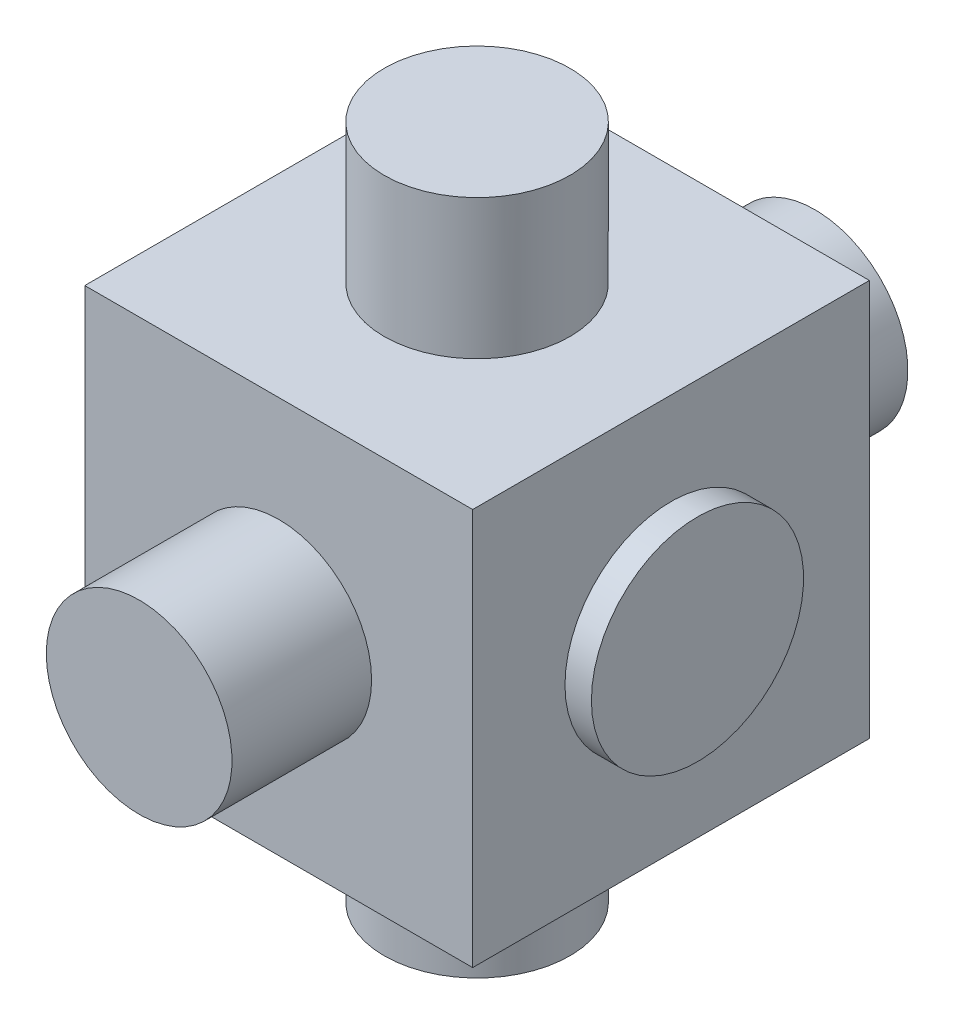
ISO-10303-21;
HEADER;
FILE_DESCRIPTION(('STEP AP214'),'2;1');
FILE_NAME('part.step','',(''),(''),'','','');
FILE_SCHEMA(('AUTOMOTIVE_DESIGN { 1 0 10303 214 1 1 1 1 }'));
ENDSEC;
DATA;
#1=APPLICATION_CONTEXT('core data for automotive mechanical design processes');
#2=APPLICATION_PROTOCOL_DEFINITION('international standard','automotive_design',2000,#1);
#3=PRODUCT_CONTEXT('',#1,'mechanical');
#4=PRODUCT('Part','Part','',(#3));
#5=PRODUCT_RELATED_PRODUCT_CATEGORY('part','',(#4));
#6=PRODUCT_DEFINITION_FORMATION('','',#4);
#7=PRODUCT_DEFINITION_CONTEXT('part definition',#1,'design');
#8=PRODUCT_DEFINITION('design','',#6,#7);
#9=PRODUCT_DEFINITION_SHAPE('','',#8);
#10=(LENGTH_UNIT() NAMED_UNIT(*) SI_UNIT(.MILLI.,.METRE.));
#11=(NAMED_UNIT(*) PLANE_ANGLE_UNIT() SI_UNIT($,.RADIAN.));
#12=(NAMED_UNIT(*) SI_UNIT($,.STERADIAN.) SOLID_ANGLE_UNIT());
#13=UNCERTAINTY_MEASURE_WITH_UNIT(LENGTH_MEASURE(1.E-05),#10,'distance_accuracy_value','');
#14=(GEOMETRIC_REPRESENTATION_CONTEXT(3) GLOBAL_UNCERTAINTY_ASSIGNED_CONTEXT((#13)) GLOBAL_UNIT_ASSIGNED_CONTEXT((#10,
#11,#12)) REPRESENTATION_CONTEXT('',''));
#15=CARTESIAN_POINT('',(0.,0.,0.));
#16=DIRECTION('',(0.,0.,1.));
#17=DIRECTION('',(1.,0.,0.));
#18=AXIS2_PLACEMENT_3D('',#15,#16,#17);
#19=CARTESIAN_POINT('',(19.4,6.75,6.75));
#20=DIRECTION('',(1.,0.,0.));
#21=DIRECTION('',(0.,0.,-1.));
#22=AXIS2_PLACEMENT_3D('',#19,#20,#21);
#23=PLANE('',#22);
#24=DIRECTION('',(0.,0.,-1.));
#25=VECTOR('',#24,1.);
#26=CARTESIAN_POINT('',(19.4,6.75,6.75));
#27=LINE('',#26,#25);
#28=CARTESIAN_POINT('',(19.4,6.75,6.75));
#29=VERTEX_POINT('',#28);
#30=CARTESIAN_POINT('',(19.4,6.75,-6.75));
#31=VERTEX_POINT('',#30);
#32=EDGE_CURVE('E75',#29,#31,#27,.T.);
#33=ORIENTED_EDGE('',*,*,#32,.T.);
#34=DIRECTION('',(0.,-1.,0.));
#35=VECTOR('',#34,1.);
#36=CARTESIAN_POINT('',(19.4,6.75,-6.75));
#37=LINE('',#36,#35);
#38=CARTESIAN_POINT('',(19.4,-6.75,-6.75));
#39=VERTEX_POINT('',#38);
#40=EDGE_CURVE('E79',#31,#39,#37,.T.);
#41=ORIENTED_EDGE('',*,*,#40,.T.);
#42=DIRECTION('',(0.,0.,-1.));
#43=VECTOR('',#42,1.);
#44=CARTESIAN_POINT('',(19.4,-6.75,6.75));
#45=LINE('',#44,#43);
#46=CARTESIAN_POINT('',(19.4,-6.75,6.75));
#47=VERTEX_POINT('',#46);
#48=EDGE_CURVE('E85',#47,#39,#45,.T.);
#49=ORIENTED_EDGE('',*,*,#48,.F.);
#50=DIRECTION('',(0.,-1.,0.));
#51=VECTOR('',#50,1.);
#52=CARTESIAN_POINT('',(19.4,6.75,6.75));
#53=LINE('',#52,#51);
#54=EDGE_CURVE('E80',#29,#47,#53,.T.);
#55=ORIENTED_EDGE('',*,*,#54,.F.);
#56=EDGE_LOOP('',(#33,#41,#49,#55));
#57=FACE_BOUND('',#56,.T.);
#58=CARTESIAN_POINT('',(19.4,0.,0.));
#59=DIRECTION('',(1.,0.,0.));
#60=DIRECTION('',(0.,0.,-1.));
#61=AXIS2_PLACEMENT_3D('',#58,#59,#60);
#62=CIRCLE('',#61,3.61);
#63=CARTESIAN_POINT('',(19.4,0.,-3.61));
#64=VERTEX_POINT('',#63);
#65=EDGE_CURVE('E11',#64,#64,#62,.F.);
#66=ORIENTED_EDGE('',*,*,#65,.F.);
#67=EDGE_LOOP('',(#66));
#68=FACE_BOUND('',#67,.T.);
#69=ADVANCED_FACE('F33',(#57,#68),#23,.F.);
#70=CARTESIAN_POINT('',(32.6,-6.75,6.75));
#71=DIRECTION('',(-1.,0.,0.));
#72=DIRECTION('',(0.,0.,1.));
#73=AXIS2_PLACEMENT_3D('',#70,#71,#72);
#74=PLANE('',#73);
#75=DIRECTION('',(0.,0.,-1.));
#76=VECTOR('',#75,1.);
#77=CARTESIAN_POINT('',(32.6,-6.75,6.75));
#78=LINE('',#77,#76);
#79=CARTESIAN_POINT('',(32.6,-6.75,6.75));
#80=VERTEX_POINT('',#79);
#81=CARTESIAN_POINT('',(32.6,-6.75,-6.75));
#82=VERTEX_POINT('',#81);
#83=EDGE_CURVE('E117',#80,#82,#78,.T.);
#84=ORIENTED_EDGE('',*,*,#83,.T.);
#85=DIRECTION('',(0.,1.,0.));
#86=VECTOR('',#85,1.);
#87=CARTESIAN_POINT('',(32.6,-6.75,-6.75));
#88=LINE('',#87,#86);
#89=CARTESIAN_POINT('',(32.6,6.75,-6.75));
#90=VERTEX_POINT('',#89);
#91=EDGE_CURVE('E109',#82,#90,#88,.T.);
#92=ORIENTED_EDGE('',*,*,#91,.T.);
#93=DIRECTION('',(0.,0.,-1.));
#94=VECTOR('',#93,1.);
#95=CARTESIAN_POINT('',(32.6,6.75,6.75));
#96=LINE('',#95,#94);
#97=CARTESIAN_POINT('',(32.6,6.75,6.75));
#98=VERTEX_POINT('',#97);
#99=EDGE_CURVE('E99',#98,#90,#96,.T.);
#100=ORIENTED_EDGE('',*,*,#99,.F.);
#101=DIRECTION('',(0.,1.,0.));
#102=VECTOR('',#101,1.);
#103=CARTESIAN_POINT('',(32.6,-6.75,6.75));
#104=LINE('',#103,#102);
#105=EDGE_CURVE('E49',#80,#98,#104,.T.);
#106=ORIENTED_EDGE('',*,*,#105,.F.);
#107=EDGE_LOOP('',(#84,#92,#100,#106));
#108=FACE_BOUND('',#107,.T.);
#109=CARTESIAN_POINT('',(32.6,0.,0.));
#110=DIRECTION('',(-1.,0.,0.));
#111=DIRECTION('',(0.,0.,1.));
#112=AXIS2_PLACEMENT_3D('',#109,#110,#111);
#113=CIRCLE('',#112,3.61);
#114=CARTESIAN_POINT('',(32.6,0.,3.61));
#115=VERTEX_POINT('',#114);
#116=EDGE_CURVE('E37',#115,#115,#113,.F.);
#117=ORIENTED_EDGE('',*,*,#116,.F.);
#118=EDGE_LOOP('',(#117));
#119=FACE_BOUND('',#118,.T.);
#120=ADVANCED_FACE('F142',(#108,#119),#74,.F.);
#121=CARTESIAN_POINT('',(0.,0.,6.75));
#122=DIRECTION('',(0.,0.,1.));
#123=DIRECTION('',(1.,0.,0.));
#124=AXIS2_PLACEMENT_3D('',#121,#122,#123);
#125=PLANE('',#124);
#126=DIRECTION('',(-1.,0.,0.));
#127=VECTOR('',#126,1.);
#128=CARTESIAN_POINT('',(32.6,6.75,6.75));
#129=LINE('',#128,#127);
#130=EDGE_CURVE('E111',#98,#29,#129,.T.);
#131=ORIENTED_EDGE('',*,*,#130,.T.);
#132=ORIENTED_EDGE('',*,*,#54,.T.);
#133=DIRECTION('',(1.,0.,0.));
#134=VECTOR('',#133,1.);
#135=CARTESIAN_POINT('',(19.4,-6.75,6.75));
#136=LINE('',#135,#134);
#137=EDGE_CURVE('E54',#47,#80,#136,.T.);
#138=ORIENTED_EDGE('',*,*,#137,.T.);
#139=ORIENTED_EDGE('',*,*,#105,.T.);
#140=EDGE_LOOP('',(#131,#132,#138,#139));
#141=FACE_BOUND('',#140,.T.);
#142=CARTESIAN_POINT('',(26.,0.,6.75));
#143=DIRECTION('',(0.,0.,1.));
#144=DIRECTION('',(1.,0.,0.));
#145=AXIS2_PLACEMENT_3D('',#142,#143,#144);
#146=CIRCLE('',#145,3.16);
#147=CARTESIAN_POINT('',(29.16,0.,6.75));
#148=VERTEX_POINT('',#147);
#149=EDGE_CURVE('E205',#148,#148,#146,.F.);
#150=ORIENTED_EDGE('',*,*,#149,.T.);
#151=EDGE_LOOP('',(#150));
#152=FACE_BOUND('',#151,.T.);
#153=ADVANCED_FACE('F139',(#141,#152),#125,.T.);
#154=CARTESIAN_POINT('',(0.,0.,-6.75));
#155=DIRECTION('',(0.,0.,1.));
#156=DIRECTION('',(1.,0.,0.));
#157=AXIS2_PLACEMENT_3D('',#154,#155,#156);
#158=PLANE('',#157);
#159=DIRECTION('',(-1.,0.,0.));
#160=VECTOR('',#159,1.);
#161=CARTESIAN_POINT('',(32.6,6.75,-6.75));
#162=LINE('',#161,#160);
#163=EDGE_CURVE('E93',#90,#31,#162,.T.);
#164=ORIENTED_EDGE('',*,*,#163,.F.);
#165=ORIENTED_EDGE('',*,*,#91,.F.);
#166=DIRECTION('',(1.,0.,0.));
#167=VECTOR('',#166,1.);
#168=CARTESIAN_POINT('',(19.4,-6.75,-6.75));
#169=LINE('',#168,#167);
#170=EDGE_CURVE('E96',#39,#82,#169,.T.);
#171=ORIENTED_EDGE('',*,*,#170,.F.);
#172=ORIENTED_EDGE('',*,*,#40,.F.);
#173=EDGE_LOOP('',(#164,#165,#171,#172));
#174=FACE_BOUND('',#173,.T.);
#175=CARTESIAN_POINT('',(26.,0.,-6.75));
#176=DIRECTION('',(0.,0.,1.));
#177=DIRECTION('',(1.,0.,0.));
#178=AXIS2_PLACEMENT_3D('',#175,#176,#177);
#179=CIRCLE('',#178,3.16);
#180=CARTESIAN_POINT('',(29.16,0.,-6.75));
#181=VERTEX_POINT('',#180);
#182=EDGE_CURVE('E121',#181,#181,#179,.F.);
#183=ORIENTED_EDGE('',*,*,#182,.F.);
#184=EDGE_LOOP('',(#183));
#185=FACE_BOUND('',#184,.T.);
#186=ADVANCED_FACE('F90',(#174,#185),#158,.F.);
#187=CARTESIAN_POINT('',(32.6,6.75,6.75));
#188=DIRECTION('',(0.,-1.,0.));
#189=DIRECTION('',(0.,0.,-1.));
#190=AXIS2_PLACEMENT_3D('',#187,#188,#189);
#191=PLANE('',#190);
#192=ORIENTED_EDGE('',*,*,#99,.T.);
#193=ORIENTED_EDGE('',*,*,#163,.T.);
#194=ORIENTED_EDGE('',*,*,#32,.F.);
#195=ORIENTED_EDGE('',*,*,#130,.F.);
#196=EDGE_LOOP('',(#192,#193,#194,#195));
#197=FACE_BOUND('',#196,.T.);
#198=CARTESIAN_POINT('',(26.,6.75,0.));
#199=DIRECTION('',(0.,-1.,0.));
#200=DIRECTION('',(0.,0.,-1.));
#201=AXIS2_PLACEMENT_3D('',#198,#199,#200);
#202=CIRCLE('',#201,3.16);
#203=CARTESIAN_POINT('',(26.,6.75,-3.16));
#204=VERTEX_POINT('',#203);
#205=EDGE_CURVE('E106',#204,#204,#202,.F.);
#206=ORIENTED_EDGE('',*,*,#205,.F.);
#207=EDGE_LOOP('',(#206));
#208=FACE_BOUND('',#207,.T.);
#209=ADVANCED_FACE('F35',(#197,#208),#191,.F.);
#210=CARTESIAN_POINT('',(19.4,-6.75,6.75));
#211=DIRECTION('',(0.,1.,0.));
#212=DIRECTION('',(0.,0.,1.));
#213=AXIS2_PLACEMENT_3D('',#210,#211,#212);
#214=PLANE('',#213);
#215=ORIENTED_EDGE('',*,*,#48,.T.);
#216=ORIENTED_EDGE('',*,*,#170,.T.);
#217=ORIENTED_EDGE('',*,*,#83,.F.);
#218=ORIENTED_EDGE('',*,*,#137,.F.);
#219=EDGE_LOOP('',(#215,#216,#217,#218));
#220=FACE_BOUND('',#219,.T.);
#221=CARTESIAN_POINT('',(26.,-6.75,0.));
#222=DIRECTION('',(0.,1.,0.));
#223=DIRECTION('',(0.,0.,1.));
#224=AXIS2_PLACEMENT_3D('',#221,#222,#223);
#225=CIRCLE('',#224,3.16);
#226=CARTESIAN_POINT('',(26.,-6.75,3.16));
#227=VERTEX_POINT('',#226);
#228=EDGE_CURVE('E84',#227,#227,#225,.F.);
#229=ORIENTED_EDGE('',*,*,#228,.F.);
#230=EDGE_LOOP('',(#229));
#231=FACE_BOUND('',#230,.T.);
#232=ADVANCED_FACE('F131',(#220,#231),#214,.F.);
#233=CARTESIAN_POINT('',(29.16,-11.5,0.));
#234=DIRECTION('',(0.,1.,0.));
#235=DIRECTION('',(0.,0.,1.));
#236=AXIS2_PLACEMENT_3D('',#233,#234,#235);
#237=PLANE('',#236);
#238=CARTESIAN_POINT('',(26.,-11.5,0.));
#239=DIRECTION('',(0.,1.,0.));
#240=DIRECTION('',(0.,0.,1.));
#241=AXIS2_PLACEMENT_3D('',#238,#239,#240);
#242=CIRCLE('',#241,3.16);
#243=CARTESIAN_POINT('',(26.,-11.5,3.16));
#244=VERTEX_POINT('',#243);
#245=EDGE_CURVE('E103',#244,#244,#242,.T.);
#246=ORIENTED_EDGE('',*,*,#245,.F.);
#247=EDGE_LOOP('',(#246));
#248=FACE_BOUND('',#247,.T.);
#249=ADVANCED_FACE('F136',(#248),#237,.F.);
#250=CARTESIAN_POINT('',(26.,-11.5,0.));
#251=DIRECTION('',(0.,1.,0.));
#252=DIRECTION('',(0.,0.,1.));
#253=AXIS2_PLACEMENT_3D('',#250,#251,#252);
#254=CYLINDRICAL_SURFACE('',#253,3.16);
#255=ORIENTED_EDGE('',*,*,#245,.T.);
#256=EDGE_LOOP('',(#255));
#257=FACE_BOUND('',#256,.T.);
#258=ORIENTED_EDGE('',*,*,#228,.T.);
#259=EDGE_LOOP('',(#258));
#260=FACE_BOUND('',#259,.T.);
#261=ADVANCED_FACE('F158',(#257,#260),#254,.T.);
#262=CARTESIAN_POINT('',(26.,11.5,0.));
#263=DIRECTION('',(0.,1.,0.));
#264=DIRECTION('',(0.,0.,1.));
#265=AXIS2_PLACEMENT_3D('',#262,#263,#264);
#266=CIRCLE('',#265,3.16);
#267=CARTESIAN_POINT('',(26.,11.5,3.16));
#268=VERTEX_POINT('',#267);
#269=EDGE_CURVE('E100',#268,#268,#266,.T.);
#270=ORIENTED_EDGE('',*,*,#269,.F.);
#271=EDGE_LOOP('',(#270));
#272=FACE_BOUND('',#271,.T.);
#273=ORIENTED_EDGE('',*,*,#205,.T.);
#274=EDGE_LOOP('',(#273));
#275=FACE_BOUND('',#274,.T.);
#276=ADVANCED_FACE('F129',(#272,#275),#254,.T.);
#277=CARTESIAN_POINT('',(26.,11.5,0.));
#278=DIRECTION('',(0.,-1.,0.));
#279=DIRECTION('',(0.,0.,-1.));
#280=AXIS2_PLACEMENT_3D('',#277,#278,#279);
#281=PLANE('',#280);
#282=ORIENTED_EDGE('',*,*,#269,.T.);
#283=EDGE_LOOP('',(#282));
#284=FACE_BOUND('',#283,.T.);
#285=ADVANCED_FACE('F151',(#284),#281,.F.);
#286=CARTESIAN_POINT('',(26.,0.,-11.5));
#287=DIRECTION('',(0.,0.,1.));
#288=DIRECTION('',(1.,0.,0.));
#289=AXIS2_PLACEMENT_3D('',#286,#287,#288);
#290=PLANE('',#289);
#291=CARTESIAN_POINT('',(26.,0.,-11.5));
#292=DIRECTION('',(0.,0.,-1.));
#293=DIRECTION('',(-1.,0.,0.));
#294=AXIS2_PLACEMENT_3D('',#291,#292,#293);
#295=CIRCLE('',#294,3.16);
#296=CARTESIAN_POINT('',(22.84,0.,-11.5));
#297=VERTEX_POINT('',#296);
#298=EDGE_CURVE('E202',#297,#297,#295,.T.);
#299=ORIENTED_EDGE('',*,*,#298,.T.);
#300=EDGE_LOOP('',(#299));
#301=FACE_BOUND('',#300,.T.);
#302=ADVANCED_FACE('F154',(#301),#290,.F.);
#303=CARTESIAN_POINT('',(26.,0.,11.5));
#304=DIRECTION('',(0.,0.,-1.));
#305=DIRECTION('',(-1.,0.,0.));
#306=AXIS2_PLACEMENT_3D('',#303,#304,#305);
#307=CYLINDRICAL_SURFACE('',#306,3.16);
#308=ORIENTED_EDGE('',*,*,#298,.F.);
#309=EDGE_LOOP('',(#308));
#310=FACE_BOUND('',#309,.T.);
#311=ORIENTED_EDGE('',*,*,#182,.T.);
#312=EDGE_LOOP('',(#311));
#313=FACE_BOUND('',#312,.T.);
#314=ADVANCED_FACE('F165',(#310,#313),#307,.T.);
#315=ORIENTED_EDGE('',*,*,#149,.F.);
#316=EDGE_LOOP('',(#315));
#317=FACE_BOUND('',#316,.T.);
#318=CARTESIAN_POINT('',(26.,0.,11.5));
#319=DIRECTION('',(0.,0.,-1.));
#320=DIRECTION('',(-1.,0.,0.));
#321=AXIS2_PLACEMENT_3D('',#318,#319,#320);
#322=CIRCLE('',#321,3.16);
#323=CARTESIAN_POINT('',(22.84,0.,11.5));
#324=VERTEX_POINT('',#323);
#325=EDGE_CURVE('E197',#324,#324,#322,.T.);
#326=ORIENTED_EDGE('',*,*,#325,.T.);
#327=EDGE_LOOP('',(#326));
#328=FACE_BOUND('',#327,.T.);
#329=ADVANCED_FACE('F167',(#317,#328),#307,.T.);
#330=CARTESIAN_POINT('',(29.16,0.,11.5));
#331=DIRECTION('',(0.,0.,-1.));
#332=DIRECTION('',(-1.,0.,0.));
#333=AXIS2_PLACEMENT_3D('',#330,#331,#332);
#334=PLANE('',#333);
#335=ORIENTED_EDGE('',*,*,#325,.F.);
#336=EDGE_LOOP('',(#335));
#337=FACE_BOUND('',#336,.T.);
#338=ADVANCED_FACE('F170',(#337),#334,.F.);
#339=CARTESIAN_POINT('',(33.5,3.61,0.));
#340=DIRECTION('',(-1.,0.,0.));
#341=DIRECTION('',(0.,0.,1.));
#342=AXIS2_PLACEMENT_3D('',#339,#340,#341);
#343=PLANE('',#342);
#344=CARTESIAN_POINT('',(33.5,0.,0.));
#345=DIRECTION('',(-1.,0.,0.));
#346=DIRECTION('',(0.,0.,1.));
#347=AXIS2_PLACEMENT_3D('',#344,#345,#346);
#348=CIRCLE('',#347,3.61);
#349=CARTESIAN_POINT('',(33.5,0.,3.61));
#350=VERTEX_POINT('',#349);
#351=EDGE_CURVE('E193',#350,#350,#348,.T.);
#352=ORIENTED_EDGE('',*,*,#351,.F.);
#353=EDGE_LOOP('',(#352));
#354=FACE_BOUND('',#353,.T.);
#355=ADVANCED_FACE('F174',(#354),#343,.F.);
#356=CARTESIAN_POINT('',(33.5,0.,0.));
#357=DIRECTION('',(-1.,0.,0.));
#358=DIRECTION('',(0.,0.,1.));
#359=AXIS2_PLACEMENT_3D('',#356,#357,#358);
#360=CYLINDRICAL_SURFACE('',#359,3.61);
#361=ORIENTED_EDGE('',*,*,#351,.T.);
#362=EDGE_LOOP('',(#361));
#363=FACE_BOUND('',#362,.T.);
#364=ORIENTED_EDGE('',*,*,#116,.T.);
#365=EDGE_LOOP('',(#364));
#366=FACE_BOUND('',#365,.T.);
#367=ADVANCED_FACE('F183',(#363,#366),#360,.T.);
#368=CARTESIAN_POINT('',(18.5,0.,0.));
#369=DIRECTION('',(-1.,0.,0.));
#370=DIRECTION('',(0.,0.,1.));
#371=AXIS2_PLACEMENT_3D('',#368,#369,#370);
#372=CIRCLE('',#371,3.61);
#373=CARTESIAN_POINT('',(18.5,0.,3.61));
#374=VERTEX_POINT('',#373);
#375=EDGE_CURVE('E194',#374,#374,#372,.T.);
#376=ORIENTED_EDGE('',*,*,#375,.F.);
#377=EDGE_LOOP('',(#376));
#378=FACE_BOUND('',#377,.T.);
#379=ORIENTED_EDGE('',*,*,#65,.T.);
#380=EDGE_LOOP('',(#379));
#381=FACE_BOUND('',#380,.T.);
#382=ADVANCED_FACE('F179',(#378,#381),#360,.T.);
#383=CARTESIAN_POINT('',(18.5,0.,0.));
#384=DIRECTION('',(1.,0.,0.));
#385=DIRECTION('',(0.,0.,-1.));
#386=AXIS2_PLACEMENT_3D('',#383,#384,#385);
#387=PLANE('',#386);
#388=ORIENTED_EDGE('',*,*,#375,.T.);
#389=EDGE_LOOP('',(#388));
#390=FACE_BOUND('',#389,.T.);
#391=ADVANCED_FACE('F176',(#390),#387,.F.);
#392=CLOSED_SHELL('',(#69,#120,#153,#186,#209,#232,#249,#261,#276,#285,#302,#314,#329,#338,#355,
#367,#382,#391));
#393=MANIFOLD_SOLID_BREP('B2',#392);
#394=ADVANCED_BREP_SHAPE_REPRESENTATION('',(#18,#393),#14);
#395=SHAPE_DEFINITION_REPRESENTATION(#9,#394);
ENDSEC;
END-ISO-10303-21;
